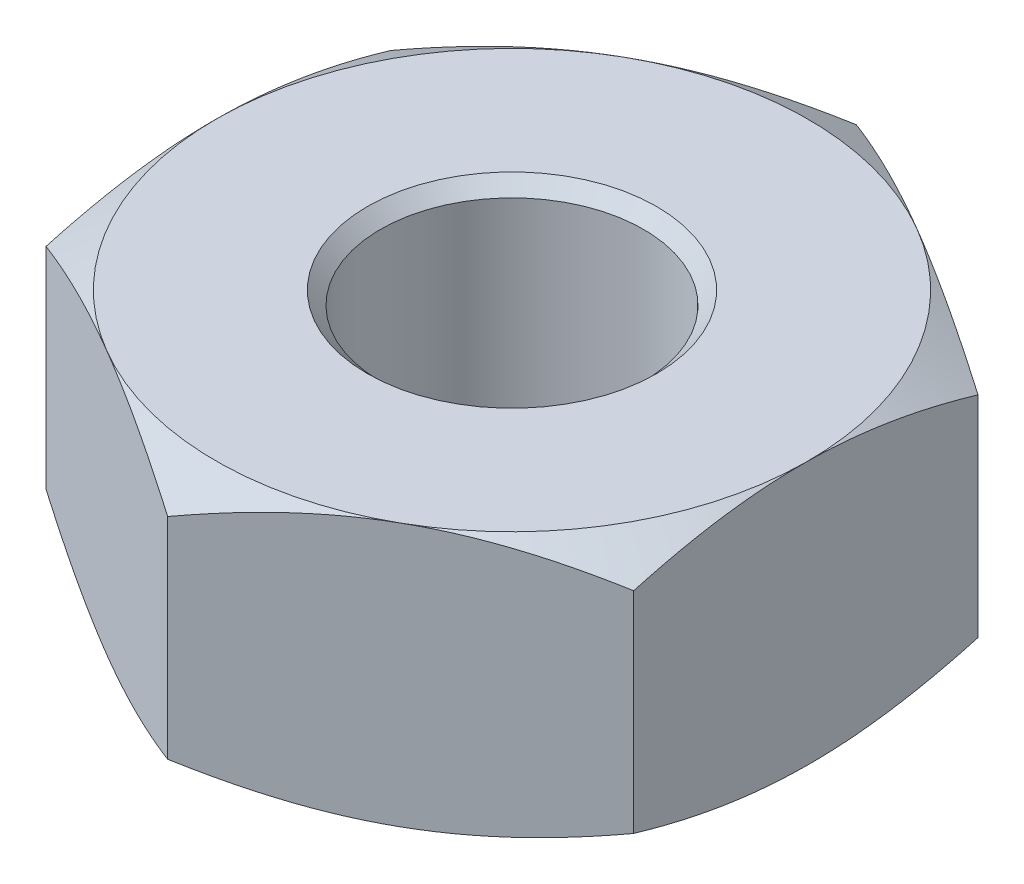
ISO-10303-21;
HEADER;
FILE_DESCRIPTION(('STEP AP214'),'2;1');
FILE_NAME('part.step','',(''),(''),'','','');
FILE_SCHEMA(('AUTOMOTIVE_DESIGN { 1 0 10303 214 1 1 1 1 }'));
ENDSEC;
DATA;
#1=APPLICATION_CONTEXT('core data for automotive mechanical design processes');
#2=APPLICATION_PROTOCOL_DEFINITION('international standard','automotive_design',2000,#1);
#3=PRODUCT_CONTEXT('',#1,'mechanical');
#4=PRODUCT('Part','Part','',(#3));
#5=PRODUCT_RELATED_PRODUCT_CATEGORY('part','',(#4));
#6=PRODUCT_DEFINITION_FORMATION('','',#4);
#7=PRODUCT_DEFINITION_CONTEXT('part definition',#1,'design');
#8=PRODUCT_DEFINITION('design','',#6,#7);
#9=PRODUCT_DEFINITION_SHAPE('','',#8);
#10=(LENGTH_UNIT() NAMED_UNIT(*) SI_UNIT(.MILLI.,.METRE.));
#11=(NAMED_UNIT(*) PLANE_ANGLE_UNIT() SI_UNIT($,.RADIAN.));
#12=(NAMED_UNIT(*) SI_UNIT($,.STERADIAN.) SOLID_ANGLE_UNIT());
#13=UNCERTAINTY_MEASURE_WITH_UNIT(LENGTH_MEASURE(1.E-05),#10,'distance_accuracy_value','');
#14=(GEOMETRIC_REPRESENTATION_CONTEXT(3) GLOBAL_UNCERTAINTY_ASSIGNED_CONTEXT((#13)) GLOBAL_UNIT_ASSIGNED_CONTEXT((#10,
#11,#12)) REPRESENTATION_CONTEXT('',''));
#15=CARTESIAN_POINT('',(0.,0.,0.));
#16=DIRECTION('',(0.,0.,1.));
#17=DIRECTION('',(1.,0.,0.));
#18=AXIS2_PLACEMENT_3D('',#15,#16,#17);
#19=CARTESIAN_POINT('',(0.,2.,0.));
#20=DIRECTION('',(0.,1.,0.));
#21=DIRECTION('',(0.,0.,1.));
#22=AXIS2_PLACEMENT_3D('',#19,#20,#21);
#23=PLANE('',#22);
#24=CARTESIAN_POINT('',(0.,2.,0.));
#25=DIRECTION('',(0.,1.,0.));
#26=DIRECTION('',(0.,0.,1.));
#27=AXIS2_PLACEMENT_3D('',#24,#25,#26);
#28=CIRCLE('',#27,1.1);
#29=CARTESIAN_POINT('',(0.,2.,1.1));
#30=VERTEX_POINT('',#29);
#31=EDGE_CURVE('E12',#30,#30,#28,.F.);
#32=ORIENTED_EDGE('',*,*,#31,.T.);
#33=EDGE_LOOP('',(#32));
#34=FACE_BOUND('',#33,.T.);
#35=CARTESIAN_POINT('',(0.,2.,0.));
#36=DIRECTION('',(0.,1.,0.));
#37=DIRECTION('',(0.,0.,1.));
#38=AXIS2_PLACEMENT_3D('',#35,#36,#37);
#39=CIRCLE('',#38,2.25);
#40=CARTESIAN_POINT('',(-1.13937233150498,2.,1.94018831307709));
#41=VERTEX_POINT('',#40);
#42=CARTESIAN_POINT('',(1.11056620149794,2.,1.95681953999096));
#43=VERTEX_POINT('',#42);
#44=EDGE_CURVE('E146',#41,#43,#39,.T.);
#45=ORIENTED_EDGE('',*,*,#44,.T.);
#46=CARTESIAN_POINT('',(2.24993853300292,2.,0.0166312269138746));
#47=VERTEX_POINT('',#46);
#48=EDGE_CURVE('E589',#43,#47,#39,.T.);
#49=ORIENTED_EDGE('',*,*,#48,.T.);
#50=CARTESIAN_POINT('',(1.13937233150498,2.,-1.94018831307709));
#51=VERTEX_POINT('',#50);
#52=EDGE_CURVE('E64',#47,#51,#39,.T.);
#53=ORIENTED_EDGE('',*,*,#52,.T.);
#54=CARTESIAN_POINT('',(-1.11056620149794,2.,-1.95681953999096));
#55=VERTEX_POINT('',#54);
#56=EDGE_CURVE('E72',#51,#55,#39,.T.);
#57=ORIENTED_EDGE('',*,*,#56,.T.);
#58=CARTESIAN_POINT('',(-2.24993853300292,2.,-0.0166312269138747));
#59=VERTEX_POINT('',#58);
#60=EDGE_CURVE('E596',#55,#59,#39,.T.);
#61=ORIENTED_EDGE('',*,*,#60,.T.);
#62=EDGE_CURVE('E594',#59,#41,#39,.T.);
#63=ORIENTED_EDGE('',*,*,#62,.T.);
#64=EDGE_LOOP('',(#45,#49,#53,#57,#61,#63));
#65=FACE_BOUND('',#64,.T.);
#66=ADVANCED_FACE('F47',(#34,#65),#23,.T.);
#67=CARTESIAN_POINT('',(-0.019204086671358,2.,2.5980052353787));
#68=DIRECTION('',(-0.49358497844353,0.,-0.869697573329316));
#69=DIRECTION('',(-0.869697573329316,0.,0.49358497844353));
#70=AXIS2_PLACEMENT_3D('',#67,#68,#69);
#71=PLANE('',#70);
#72=CARTESIAN_POINT('',(-0.019404086671358,1.79897171609335,2.59811874264687));
#73=CARTESIAN_POINT('',(0.0798924126922162,1.83194468035985,2.54176437073542));
#74=CARTESIAN_POINT('',(0.18004603057104,1.86193269843477,2.48492355291812));
#75=CARTESIAN_POINT('',(0.382087634343671,1.91427779465075,2.37025760040655));
#76=CARTESIAN_POINT('',(0.483979210995293,1.93661635379579,2.31243042782672));
#77=CARTESIAN_POINT('',(0.686499571700327,1.9713905466787,2.19749276335756));
#78=CARTESIAN_POINT('',(0.787097190385136,1.98405760458851,2.14039995894748));
#79=CARTESIAN_POINT('',(0.988765922545457,1.99918112088683,2.02594562462638));
#80=CARTESIAN_POINT('',(1.08983630270829,2.00165010107095,1.96858451089695));
#81=CARTESIAN_POINT('',(1.2787018264508,1.99652159119054,1.86139646263287));
#82=CARTESIAN_POINT('',(1.36652520157543,1.99018332662177,1.8115535056705));
#83=CARTESIAN_POINT('',(1.5415997663507,1.97009231663067,1.71219232779598));
#84=CARTESIAN_POINT('',(1.62885035017403,1.95633270401325,1.66267445071285));
#85=CARTESIAN_POINT('',(1.80428606550557,1.92193378028852,1.56310830677311));
#86=CARTESIAN_POINT('',(1.89244898584057,1.90114861172772,1.51307264556449));
#87=CARTESIAN_POINT('',(2.06745968061786,1.85397408560432,1.41374771623491));
#88=CARTESIAN_POINT('',(2.1543096982811,1.82759581686759,1.36445717500455));
#89=CARTESIAN_POINT('',(2.24053648966724,1.79897171609335,1.31552033733505));
#90=B_SPLINE_CURVE_WITH_KNOTS('',3,(#72,#73,#74,#75,#76,#77,#78,#79,#80,#81,#82,#83,#84,#85,#86,
#87,#88,#89),.UNSPECIFIED.,.F.,.F.,(4,2,2,2,2,2,2,2,4),(0.,0.356658759244272,0.714174967851121,
1.06284222228415,1.41108123519596,1.71433325845153,2.01786637249107,2.32813353663123,
2.63779122560796),.UNSPECIFIED.);
#91=CARTESIAN_POINT('',(-0.0192040866713581,1.79903810567666,2.5980052353787));
#92=VERTEX_POINT('',#91);
#93=EDGE_CURVE('E143',#92,#43,#90,.T.);
#94=ORIENTED_EDGE('',*,*,#93,.F.);
#95=DIRECTION('',(0.,-1.,0.));
#96=VECTOR('',#95,1.);
#97=CARTESIAN_POINT('',(-0.019204086671358,2.,2.5980052353787));
#98=LINE('',#97,#96);
#99=CARTESIAN_POINT('',(-0.019204086671358,0.200961894323341,2.5980052353787));
#100=VERTEX_POINT('',#99);
#101=EDGE_CURVE('E158',#92,#100,#98,.T.);
#102=ORIENTED_EDGE('',*,*,#101,.T.);
#103=CARTESIAN_POINT('',(-0.019404086671358,0.201028283906652,2.59811874264687));
#104=CARTESIAN_POINT('',(0.079892412692216,0.168055319640151,2.54176437073542));
#105=CARTESIAN_POINT('',(0.18004603057104,0.138067301565225,2.48492355291812));
#106=CARTESIAN_POINT('',(0.382087634343672,0.0857222053492496,2.37025760040655));
#107=CARTESIAN_POINT('',(0.483979210995293,0.0633836462042078,2.31243042782672));
#108=CARTESIAN_POINT('',(0.686499571700327,0.0286094533212978,2.19749276335756));
#109=CARTESIAN_POINT('',(0.787097190385136,0.0159423954114897,2.14039995894748));
#110=CARTESIAN_POINT('',(0.988765922545457,0.000818879113173495,2.02594562462638));
#111=CARTESIAN_POINT('',(1.08983630270829,-0.00165010107094531,1.96858451089695));
#112=CARTESIAN_POINT('',(1.2787018264508,0.00347840880945581,1.86139646263287));
#113=CARTESIAN_POINT('',(1.36652520157543,0.00981667337823192,1.8115535056705));
#114=CARTESIAN_POINT('',(1.5415997663507,0.0299076833693292,1.71219232779598));
#115=CARTESIAN_POINT('',(1.62885035017403,0.0436672959867464,1.66267445071285));
#116=CARTESIAN_POINT('',(1.80428606550557,0.0780662197114798,1.56310830677311));
#117=CARTESIAN_POINT('',(1.89244898584057,0.098851388272283,1.51307264556449));
#118=CARTESIAN_POINT('',(2.06745968061786,0.146025914395682,1.41374771623491));
#119=CARTESIAN_POINT('',(2.1543096982811,0.172404183132409,1.36445717500455));
#120=CARTESIAN_POINT('',(2.24053648966724,0.201028283906651,1.31552033733505));
#121=B_SPLINE_CURVE_WITH_KNOTS('',3,(#103,#104,#105,#106,#107,#108,#109,#110,#111,#112,#113,
#114,#115,#116,#117,#118,#119,#120),.UNSPECIFIED.,.F.,.F.,(4,2,2,2,2,2,2,2,4),(0.,
0.356658759244272,0.714174967851121,1.06284222228415,1.41108123519596,1.71433325845153,
2.01786637249107,2.32813353663123,2.63779122560796),.UNSPECIFIED.);
#122=CARTESIAN_POINT('',(1.11056620149794,0.,1.95681953999096));
#123=VERTEX_POINT('',#122);
#124=EDGE_CURVE('E178',#100,#123,#121,.T.);
#125=ORIENTED_EDGE('',*,*,#124,.T.);
#126=CARTESIAN_POINT('',(2.24033648966724,0.200961894323341,1.31563384460322));
#127=VERTEX_POINT('',#126);
#128=EDGE_CURVE('E220',#123,#127,#121,.T.);
#129=ORIENTED_EDGE('',*,*,#128,.T.);
#130=DIRECTION('',(0.,-1.,0.));
#131=VECTOR('',#130,1.);
#132=CARTESIAN_POINT('',(2.24033648966724,2.,1.31563384460322));
#133=LINE('',#132,#131);
#134=CARTESIAN_POINT('',(2.24033648966724,1.79903810567666,1.31563384460322));
#135=VERTEX_POINT('',#134);
#136=EDGE_CURVE('E190',#135,#127,#133,.T.);
#137=ORIENTED_EDGE('',*,*,#136,.F.);
#138=EDGE_CURVE('E161',#43,#135,#90,.T.);
#139=ORIENTED_EDGE('',*,*,#138,.F.);
#140=EDGE_LOOP('',(#94,#102,#125,#129,#137,#139));
#141=FACE_BOUND('',#140,.T.);
#142=ADVANCED_FACE('F156',(#141),#71,.F.);
#143=CARTESIAN_POINT('',(2.24033648966724,2.,1.31563384460322));
#144=DIRECTION('',(-0.999972681334632,0.,-0.00739165640616651));
#145=DIRECTION('',(-0.00739165640616651,0.,0.999972681334632));
#146=AXIS2_PLACEMENT_3D('',#143,#144,#145);
#147=PLANE('',#146);
#148=CARTESIAN_POINT('',(2.24033501129557,1.79898036573907,1.31583384460322));
#149=CARTESIAN_POINT('',(2.24117893955017,1.83195261966336,1.20166387332302));
#150=CARTESIAN_POINT('',(2.24203015252638,1.86193988323136,1.08650839592668));
#151=CARTESIAN_POINT('',(2.24374731869573,1.91428341346944,0.854203325951998));
#152=CARTESIAN_POINT('',(2.24461330240473,1.93662116212813,0.737049605067672));
#153=CARTESIAN_POINT('',(2.24633453737148,1.97139375273715,0.504194091995021));
#154=CARTESIAN_POINT('',(2.24718952376777,1.98406001397112,0.388528131319774));
#155=CARTESIAN_POINT('',(2.24890352038739,1.99918199043516,0.156651850640805));
#156=CARTESIAN_POINT('',(2.24976252437914,2.00165022680918,0.0404423736706198));
#157=CARTESIAN_POINT('',(2.25136767604305,1.99652054119152,-0.176708928433563));
#158=CARTESIAN_POINT('',(2.25211406377353,1.99018213255518,-0.277683229612759));
#159=CARTESIAN_POINT('',(2.25360197643048,1.97009151228299,-0.478973972498862));
#160=CARTESIAN_POINT('',(2.25434349620899,1.95633243500107,-0.579289717771426));
#161=CARTESIAN_POINT('',(2.25583447765745,1.92193518251059,-0.780995618980474));
#162=CARTESIAN_POINT('',(2.25658375058116,1.90115117135797,-0.882360240575894));
#163=CARTESIAN_POINT('',(2.25807111999577,1.85397939984882,-1.08357749147799));
#164=CARTESIAN_POINT('',(2.25880923554803,1.82760272613253,-1.18343269948262));
#165=CARTESIAN_POINT('',(2.25954205471027,1.79898036573907,-1.28257139077547));
#166=B_SPLINE_CURVE_WITH_KNOTS('',3,(#148,#149,#150,#151,#152,#153,#154,#155,#156,#157,#158,
#159,#160,#161,#162,#163,#164,#165),.UNSPECIFIED.,.F.,.F.,(4,2,2,2,2,2,2,2,4),(0.,
0.356656707733596,0.71417080864926,1.06283620758789,1.4110733873951,1.71431215259249,
2.01783195857169,2.32808511030932,2.63772888629171),.UNSPECIFIED.);
#167=EDGE_CURVE('E292',#135,#47,#166,.T.);
#168=ORIENTED_EDGE('',*,*,#167,.F.);
#169=ORIENTED_EDGE('',*,*,#136,.T.);
#170=CARTESIAN_POINT('',(2.24033501129557,0.201019634260934,1.31583384460322));
#171=CARTESIAN_POINT('',(2.24117893955017,0.168047380336639,1.20166387332302));
#172=CARTESIAN_POINT('',(2.24203015252638,0.138060116768636,1.08650839592668));
#173=CARTESIAN_POINT('',(2.24374731869573,0.0857165865305638,0.854203325951998));
#174=CARTESIAN_POINT('',(2.24461330240473,0.0633788378718654,0.737049605067672));
#175=CARTESIAN_POINT('',(2.24633453737148,0.0286062472628484,0.504194091995021));
#176=CARTESIAN_POINT('',(2.24718952376777,0.0159399860288838,0.388528131319775));
#177=CARTESIAN_POINT('',(2.24890352038739,0.000818009564838995,0.156651850640806));
#178=CARTESIAN_POINT('',(2.24976252437914,-0.00165022680917771,0.04044237367062));
#179=CARTESIAN_POINT('',(2.25136767604305,0.00347945880848328,-0.176708928433562));
#180=CARTESIAN_POINT('',(2.25211406377353,0.00981786744482197,-0.277683229612759));
#181=CARTESIAN_POINT('',(2.25360197643048,0.0299084877170064,-0.478973972498862));
#182=CARTESIAN_POINT('',(2.25434349620899,0.0436675649989339,-0.579289717771426));
#183=CARTESIAN_POINT('',(2.25583447765745,0.0780648174894089,-0.780995618980474));
#184=CARTESIAN_POINT('',(2.25658375058116,0.0988488286420346,-0.882360240575894));
#185=CARTESIAN_POINT('',(2.25807111999577,0.146020600151181,-1.08357749147799));
#186=CARTESIAN_POINT('',(2.25880923554803,0.172397273867474,-1.18343269948262));
#187=CARTESIAN_POINT('',(2.25954205471027,0.201019634260934,-1.28257139077547));
#188=B_SPLINE_CURVE_WITH_KNOTS('',3,(#170,#171,#172,#173,#174,#175,#176,#177,#178,#179,#180,
#181,#182,#183,#184,#185,#186,#187),.UNSPECIFIED.,.F.,.F.,(4,2,2,2,2,2,2,2,4),(0.,
0.356656707733596,0.71417080864926,1.06283620758789,1.4110733873951,1.71431215259249,
2.01783195857169,2.32808511030932,2.63772888629171),.UNSPECIFIED.);
#189=CARTESIAN_POINT('',(2.24993853300292,0.,0.0166312269138746));
#190=VERTEX_POINT('',#189);
#191=EDGE_CURVE('E379',#127,#190,#188,.T.);
#192=ORIENTED_EDGE('',*,*,#191,.T.);
#193=CARTESIAN_POINT('',(2.2595405763386,0.200961894323341,-1.28237139077547));
#194=VERTEX_POINT('',#193);
#195=EDGE_CURVE('E254',#190,#194,#188,.T.);
#196=ORIENTED_EDGE('',*,*,#195,.T.);
#197=DIRECTION('',(0.,-1.,0.));
#198=VECTOR('',#197,1.);
#199=CARTESIAN_POINT('',(2.2595405763386,2.,-1.28237139077547));
#200=LINE('',#199,#198);
#201=CARTESIAN_POINT('',(2.2595405763386,1.79903810567666,-1.28237139077547));
#202=VERTEX_POINT('',#201);
#203=EDGE_CURVE('E187',#202,#194,#200,.T.);
#204=ORIENTED_EDGE('',*,*,#203,.F.);
#205=EDGE_CURVE('E286',#47,#202,#166,.T.);
#206=ORIENTED_EDGE('',*,*,#205,.F.);
#207=EDGE_LOOP('',(#168,#169,#192,#196,#204,#206));
#208=FACE_BOUND('',#207,.T.);
#209=ADVANCED_FACE('F264',(#208),#147,.F.);
#210=CARTESIAN_POINT('',(2.2595405763386,2.,-1.28237139077547));
#211=DIRECTION('',(-0.506387702891102,0.,0.862305916923149));
#212=DIRECTION('',(0.862305916923149,0.,0.506387702891102));
#213=AXIS2_PLACEMENT_3D('',#210,#211,#212);
#214=PLANE('',#213);
#215=CARTESIAN_POINT('',(2.2597405763386,1.79897114696605,-1.28225394111104));
#216=CARTESIAN_POINT('',(2.16128798027797,1.83194415797097,-1.34007006295873));
#217=CARTESIAN_POINT('',(2.06198555026358,1.86193222569022,-1.39838524836986));
#218=CARTESIAN_POINT('',(1.86166105996861,1.91427742494297,-1.51602546918067));
#219=CARTESIAN_POINT('',(1.76063543943007,1.93661603741567,-1.57535259533585));
#220=CARTESIAN_POINT('',(1.5598362595915,1.97139033572364,-1.69327157678467));
#221=CARTESIAN_POINT('',(1.46009360090853,1.98405744605249,-1.75184528574279));
#222=CARTESIAN_POINT('',(1.26013880952242,1.99918106366771,-1.86926840148966));
#223=CARTESIAN_POINT('',(1.15992740390653,2.00165009279258,-1.92811738129765));
#224=CARTESIAN_POINT('',(0.97266678196038,1.99652166027434,-2.03808586733985));
#225=CARTESIAN_POINT('',(0.885589574913018,1.99018340518613,-2.08922181107572));
#226=CARTESIAN_POINT('',(0.712002485250336,1.97009236955417,-2.19116053822662));
#227=CARTESIAN_POINT('',(0.625493203321401,1.95633272171342,-2.24196296888958));
#228=CARTESIAN_POINT('',(0.451548027439314,1.9219336880258,-2.34411198157202));
#229=CARTESIAN_POINT('',(0.364134156106762,1.90114844331011,-2.39544563084449));
#230=CARTESIAN_POINT('',(0.190610390501632,1.8539737359391,-2.49734717104884));
#231=CARTESIAN_POINT('',(0.104498272042679,1.82759536225347,-2.54791636813044));
#232=CARTESIAN_POINT('',(0.0190040866713591,1.79897114696605,-2.59812268504313));
#233=B_SPLINE_CURVE_WITH_KNOTS('',3,(#215,#216,#217,#218,#219,#220,#221,#222,#223,#224,#225,
#226,#227,#228,#229,#230,#231,#232),.UNSPECIFIED.,.F.,.F.,(4,2,2,2,2,2,2,2,4),(0.,
0.356658894229,0.714175241517126,1.06284261803755,1.41108175156354,1.71433464716037,
2.01786863683135,2.3281367229481,2.63779532736029),.UNSPECIFIED.);
#234=EDGE_CURVE('E278',#202,#51,#233,.T.);
#235=ORIENTED_EDGE('',*,*,#234,.F.);
#236=ORIENTED_EDGE('',*,*,#203,.T.);
#237=CARTESIAN_POINT('',(2.2597405763386,0.201028853033953,-1.28225394111104));
#238=CARTESIAN_POINT('',(2.16128798027797,0.168055842029029,-1.34007006295873));
#239=CARTESIAN_POINT('',(2.06198555026358,0.138067774309778,-1.39838524836986));
#240=CARTESIAN_POINT('',(1.86166105996861,0.0857225750570337,-1.51602546918067));
#241=CARTESIAN_POINT('',(1.76063543943007,0.0633839625843332,-1.57535259533585));
#242=CARTESIAN_POINT('',(1.5598362595915,0.0286096642763593,-1.69327157678467));
#243=CARTESIAN_POINT('',(1.46009360090853,0.0159425539475146,-1.75184528574279));
#244=CARTESIAN_POINT('',(1.26013880952242,0.000818936332290941,-1.86926840148966));
#245=CARTESIAN_POINT('',(1.15992740390653,-0.00165009279257767,-1.92811738129765));
#246=CARTESIAN_POINT('',(0.97266678196038,0.00347833972565565,-2.03808586733985));
#247=CARTESIAN_POINT('',(0.885589574913019,0.00981659481387424,-2.08922181107572));
#248=CARTESIAN_POINT('',(0.712002485250336,0.0299076304458253,-2.19116053822662));
#249=CARTESIAN_POINT('',(0.625493203321401,0.0436672782865831,-2.24196296888958));
#250=CARTESIAN_POINT('',(0.451548027439314,0.0780663119742041,-2.34411198157202));
#251=CARTESIAN_POINT('',(0.364134156106762,0.0988515566898882,-2.39544563084449));
#252=CARTESIAN_POINT('',(0.190610390501632,0.146026264060897,-2.49734717104884));
#253=CARTESIAN_POINT('',(0.104498272042678,0.172404637746534,-2.54791636813044));
#254=CARTESIAN_POINT('',(0.019004086671359,0.201028853033953,-2.59812268504313));
#255=B_SPLINE_CURVE_WITH_KNOTS('',3,(#237,#238,#239,#240,#241,#242,#243,#244,#245,#246,#247,
#248,#249,#250,#251,#252,#253,#254),.UNSPECIFIED.,.F.,.F.,(4,2,2,2,2,2,2,2,4),(0.,
0.356658894229,0.714175241517126,1.06284261803755,1.41108175156354,1.71433464716037,
2.01786863683135,2.3281367229481,2.63779532736029),.UNSPECIFIED.);
#256=CARTESIAN_POINT('',(1.13937233150498,0.,-1.94018831307709));
#257=VERTEX_POINT('',#256);
#258=EDGE_CURVE('E252',#194,#257,#255,.T.);
#259=ORIENTED_EDGE('',*,*,#258,.T.);
#260=CARTESIAN_POINT('',(0.019204086671359,0.200961894323341,-2.5980052353787));
#261=VERTEX_POINT('',#260);
#262=EDGE_CURVE('E244',#257,#261,#255,.T.);
#263=ORIENTED_EDGE('',*,*,#262,.T.);
#264=DIRECTION('',(0.,-1.,0.));
#265=VECTOR('',#264,1.);
#266=CARTESIAN_POINT('',(0.019204086671359,2.,-2.5980052353787));
#267=LINE('',#266,#265);
#268=CARTESIAN_POINT('',(0.019204086671359,1.79903810567666,-2.5980052353787));
#269=VERTEX_POINT('',#268);
#270=EDGE_CURVE('E184',#269,#261,#267,.T.);
#271=ORIENTED_EDGE('',*,*,#270,.F.);
#272=EDGE_CURVE('E270',#51,#269,#233,.T.);
#273=ORIENTED_EDGE('',*,*,#272,.F.);
#274=EDGE_LOOP('',(#235,#236,#259,#263,#271,#273));
#275=FACE_BOUND('',#274,.T.);
#276=ADVANCED_FACE('F260',(#275),#214,.F.);
#277=CARTESIAN_POINT('',(0.019204086671359,2.,-2.5980052353787));
#278=DIRECTION('',(0.49358497844353,0.,0.869697573329316));
#279=DIRECTION('',(0.869697573329316,0.,-0.49358497844353));
#280=AXIS2_PLACEMENT_3D('',#277,#278,#279);
#281=PLANE('',#280);
#282=CARTESIAN_POINT('',(0.019404086671359,1.79897171609335,-2.59811874264687));
#283=CARTESIAN_POINT('',(-0.0798924126922153,1.83194468035985,-2.54176437073542));
#284=CARTESIAN_POINT('',(-0.180046030571039,1.86193269843477,-2.48492355291812));
#285=CARTESIAN_POINT('',(-0.38208763434367,1.91427779465075,-2.37025760040655));
#286=CARTESIAN_POINT('',(-0.483979210995292,1.93661635379579,-2.31243042782672));
#287=CARTESIAN_POINT('',(-0.686499571700326,1.9713905466787,-2.19749276335756));
#288=CARTESIAN_POINT('',(-0.787097190385135,1.98405760458851,-2.14039995894748));
#289=CARTESIAN_POINT('',(-0.988765922545456,1.99918112088683,-2.02594562462638));
#290=CARTESIAN_POINT('',(-1.08983630270829,2.00165010107095,-1.96858451089695));
#291=CARTESIAN_POINT('',(-1.2787018264508,1.99652159119054,-1.86139646263287));
#292=CARTESIAN_POINT('',(-1.36652520157543,1.99018332662177,-1.8115535056705));
#293=CARTESIAN_POINT('',(-1.5415997663507,1.97009231663067,-1.71219232779598));
#294=CARTESIAN_POINT('',(-1.62885035017403,1.95633270401325,-1.66267445071285));
#295=CARTESIAN_POINT('',(-1.80428606550557,1.92193378028852,-1.56310830677311));
#296=CARTESIAN_POINT('',(-1.89244898584057,1.90114861172772,-1.51307264556449));
#297=CARTESIAN_POINT('',(-2.06745968061786,1.85397408560432,-1.41374771623491));
#298=CARTESIAN_POINT('',(-2.1543096982811,1.82759581686759,-1.36445717500455));
#299=CARTESIAN_POINT('',(-2.24053648966724,1.79897171609335,-1.31552033733505));
#300=B_SPLINE_CURVE_WITH_KNOTS('',3,(#282,#283,#284,#285,#286,#287,#288,#289,#290,#291,#292,
#293,#294,#295,#296,#297,#298,#299),.UNSPECIFIED.,.F.,.F.,(4,2,2,2,2,2,2,2,4),(0.,
0.356658759244272,0.714174967851121,1.06284222228415,1.41108123519596,1.71433325845153,
2.01786637249107,2.32813353663123,2.63779122560796),.UNSPECIFIED.);
#301=EDGE_CURVE('E279',#269,#55,#300,.T.);
#302=ORIENTED_EDGE('',*,*,#301,.F.);
#303=ORIENTED_EDGE('',*,*,#270,.T.);
#304=CARTESIAN_POINT('',(0.019404086671359,0.201028283906652,-2.59811874264687));
#305=CARTESIAN_POINT('',(-0.0798924126922153,0.168055319640151,-2.54176437073542));
#306=CARTESIAN_POINT('',(-0.180046030571039,0.138067301565225,-2.48492355291812));
#307=CARTESIAN_POINT('',(-0.38208763434367,0.0857222053492496,-2.37025760040655));
#308=CARTESIAN_POINT('',(-0.483979210995292,0.0633836462042076,-2.31243042782672));
#309=CARTESIAN_POINT('',(-0.686499571700326,0.0286094533212976,-2.19749276335756));
#310=CARTESIAN_POINT('',(-0.787097190385135,0.0159423954114894,-2.14039995894748));
#311=CARTESIAN_POINT('',(-0.988765922545456,0.00081887911317339,-2.02594562462638));
#312=CARTESIAN_POINT('',(-1.08983630270829,-0.00165010107094525,-1.96858451089695));
#313=CARTESIAN_POINT('',(-1.2787018264508,0.00347840880945576,-1.86139646263287));
#314=CARTESIAN_POINT('',(-1.36652520157543,0.00981667337823165,-1.8115535056705));
#315=CARTESIAN_POINT('',(-1.5415997663507,0.0299076833693289,-1.71219232779598));
#316=CARTESIAN_POINT('',(-1.62885035017403,0.0436672959867464,-1.66267445071285));
#317=CARTESIAN_POINT('',(-1.80428606550557,0.07806621971148,-1.56310830677311));
#318=CARTESIAN_POINT('',(-1.89244898584057,0.0988513882722831,-1.51307264556449));
#319=CARTESIAN_POINT('',(-2.06745968061786,0.146025914395682,-1.41374771623491));
#320=CARTESIAN_POINT('',(-2.1543096982811,0.172404183132409,-1.36445717500455));
#321=CARTESIAN_POINT('',(-2.24053648966724,0.201028283906652,-1.31552033733505));
#322=B_SPLINE_CURVE_WITH_KNOTS('',3,(#304,#305,#306,#307,#308,#309,#310,#311,#312,#313,#314,
#315,#316,#317,#318,#319,#320,#321),.UNSPECIFIED.,.F.,.F.,(4,2,2,2,2,2,2,2,4),(0.,
0.356658759244272,0.714174967851121,1.06284222228415,1.41108123519596,1.71433325845153,
2.01786637249107,2.32813353663123,2.63779122560796),.UNSPECIFIED.);
#323=CARTESIAN_POINT('',(-1.11056620149794,0.,-1.95681953999096));
#324=VERTEX_POINT('',#323);
#325=EDGE_CURVE('E253',#261,#324,#322,.T.);
#326=ORIENTED_EDGE('',*,*,#325,.T.);
#327=CARTESIAN_POINT('',(-2.24033648966724,0.200961894323341,-1.31563384460322));
#328=VERTEX_POINT('',#327);
#329=EDGE_CURVE('E237',#324,#328,#322,.T.);
#330=ORIENTED_EDGE('',*,*,#329,.T.);
#331=DIRECTION('',(0.,-1.,0.));
#332=VECTOR('',#331,1.);
#333=CARTESIAN_POINT('',(-2.24033648966724,2.,-1.31563384460322));
#334=LINE('',#333,#332);
#335=CARTESIAN_POINT('',(-2.24033648966724,1.79903810567666,-1.31563384460322));
#336=VERTEX_POINT('',#335);
#337=EDGE_CURVE('E175',#336,#328,#334,.T.);
#338=ORIENTED_EDGE('',*,*,#337,.F.);
#339=EDGE_CURVE('E280',#55,#336,#300,.T.);
#340=ORIENTED_EDGE('',*,*,#339,.F.);
#341=EDGE_LOOP('',(#302,#303,#326,#330,#338,#340));
#342=FACE_BOUND('',#341,.T.);
#343=ADVANCED_FACE('F263',(#342),#281,.F.);
#344=CARTESIAN_POINT('',(-2.24033648966724,2.,-1.31563384460322));
#345=DIRECTION('',(0.999972681334632,0.,0.00739165640616651));
#346=DIRECTION('',(0.00739165640616651,0.,-0.999972681334632));
#347=AXIS2_PLACEMENT_3D('',#344,#345,#346);
#348=PLANE('',#347);
#349=CARTESIAN_POINT('',(-2.24033501129557,1.79898036573907,-1.31583384460322));
#350=CARTESIAN_POINT('',(-2.24117893955017,1.83195261966336,-1.20166387332302));
#351=CARTESIAN_POINT('',(-2.24203015252638,1.86193988323136,-1.08650839592668));
#352=CARTESIAN_POINT('',(-2.24374731869573,1.91428341346944,-0.854203325951998));
#353=CARTESIAN_POINT('',(-2.24461330240473,1.93662116212813,-0.737049605067672));
#354=CARTESIAN_POINT('',(-2.24633453737149,1.97139375273715,-0.504194091995021));
#355=CARTESIAN_POINT('',(-2.24718952376777,1.98406001397112,-0.388528131319774));
#356=CARTESIAN_POINT('',(-2.24890352038739,1.99918199043516,-0.156651850640805));
#357=CARTESIAN_POINT('',(-2.24976252437914,2.00165022680918,-0.0404423736706198));
#358=CARTESIAN_POINT('',(-2.25136767604305,1.99652054119152,0.176708928433563));
#359=CARTESIAN_POINT('',(-2.25211406377353,1.99018213255518,0.277683229612759));
#360=CARTESIAN_POINT('',(-2.25360197643048,1.97009151228299,0.478973972498862));
#361=CARTESIAN_POINT('',(-2.25434349620899,1.95633243500107,0.579289717771426));
#362=CARTESIAN_POINT('',(-2.25583447765745,1.92193518251059,0.780995618980474));
#363=CARTESIAN_POINT('',(-2.25658375058116,1.90115117135797,0.882360240575893));
#364=CARTESIAN_POINT('',(-2.25807111999577,1.85397939984882,1.08357749147799));
#365=CARTESIAN_POINT('',(-2.25880923554803,1.82760272613253,1.18343269948262));
#366=CARTESIAN_POINT('',(-2.25954205471027,1.79898036573907,1.28257139077547));
#367=B_SPLINE_CURVE_WITH_KNOTS('',3,(#349,#350,#351,#352,#353,#354,#355,#356,#357,#358,#359,
#360,#361,#362,#363,#364,#365,#366),.UNSPECIFIED.,.F.,.F.,(4,2,2,2,2,2,2,2,4),(0.,
0.356656707733596,0.71417080864926,1.06283620758789,1.4110733873951,1.71431215259249,
2.01783195857169,2.32808511030932,2.63772888629171),.UNSPECIFIED.);
#368=EDGE_CURVE('E588',#336,#59,#367,.T.);
#369=ORIENTED_EDGE('',*,*,#368,.F.);
#370=ORIENTED_EDGE('',*,*,#337,.T.);
#371=CARTESIAN_POINT('',(-2.24033501129557,0.201019634260934,-1.31583384460322));
#372=CARTESIAN_POINT('',(-2.24117893955017,0.168047380336639,-1.20166387332302));
#373=CARTESIAN_POINT('',(-2.24203015252638,0.138060116768636,-1.08650839592668));
#374=CARTESIAN_POINT('',(-2.24374731869573,0.0857165865305641,-0.854203325951998));
#375=CARTESIAN_POINT('',(-2.24461330240473,0.0633788378718657,-0.737049605067672));
#376=CARTESIAN_POINT('',(-2.24633453737149,0.0286062472628487,-0.504194091995021));
#377=CARTESIAN_POINT('',(-2.24718952376777,0.0159399860288839,-0.388528131319774));
#378=CARTESIAN_POINT('',(-2.24890352038739,0.000818009564839355,-0.156651850640805));
#379=CARTESIAN_POINT('',(-2.24976252437914,-0.0016502268091771,-0.0404423736706199));
#380=CARTESIAN_POINT('',(-2.25136767604305,0.0034794588084837,0.176708928433563));
#381=CARTESIAN_POINT('',(-2.25211406377353,0.00981786744482204,0.277683229612759));
#382=CARTESIAN_POINT('',(-2.25360197643048,0.0299084877170064,0.478973972498862));
#383=CARTESIAN_POINT('',(-2.25434349620899,0.043667564998934,0.579289717771426));
#384=CARTESIAN_POINT('',(-2.25583447765745,0.0780648174894093,0.780995618980474));
#385=CARTESIAN_POINT('',(-2.25658375058116,0.0988488286420349,0.882360240575893));
#386=CARTESIAN_POINT('',(-2.25807111999577,0.146020600151181,1.08357749147799));
#387=CARTESIAN_POINT('',(-2.25880923554803,0.172397273867474,1.18343269948262));
#388=CARTESIAN_POINT('',(-2.25954205471027,0.201019634260934,1.28257139077547));
#389=B_SPLINE_CURVE_WITH_KNOTS('',3,(#371,#372,#373,#374,#375,#376,#377,#378,#379,#380,#381,
#382,#383,#384,#385,#386,#387,#388),.UNSPECIFIED.,.F.,.F.,(4,2,2,2,2,2,2,2,4),(0.,
0.356656707733596,0.71417080864926,1.06283620758789,1.4110733873951,1.71431215259249,
2.01783195857169,2.32808511030932,2.63772888629171),.UNSPECIFIED.);
#390=CARTESIAN_POINT('',(-2.24993853300292,0.,-0.0166312269138747));
#391=VERTEX_POINT('',#390);
#392=EDGE_CURVE('E341',#328,#391,#389,.T.);
#393=ORIENTED_EDGE('',*,*,#392,.T.);
#394=CARTESIAN_POINT('',(-2.2595405763386,0.200961894323341,1.28237139077547));
#395=VERTEX_POINT('',#394);
#396=EDGE_CURVE('E230',#391,#395,#389,.T.);
#397=ORIENTED_EDGE('',*,*,#396,.T.);
#398=DIRECTION('',(0.,-1.,0.));
#399=VECTOR('',#398,1.);
#400=CARTESIAN_POINT('',(-2.2595405763386,2.,1.28237139077547));
#401=LINE('',#400,#399);
#402=CARTESIAN_POINT('',(-2.2595405763386,1.79903810567666,1.28237139077547));
#403=VERTEX_POINT('',#402);
#404=EDGE_CURVE('E170',#403,#395,#401,.T.);
#405=ORIENTED_EDGE('',*,*,#404,.F.);
#406=EDGE_CURVE('E581',#59,#403,#367,.T.);
#407=ORIENTED_EDGE('',*,*,#406,.F.);
#408=EDGE_LOOP('',(#369,#370,#393,#397,#405,#407));
#409=FACE_BOUND('',#408,.T.);
#410=ADVANCED_FACE('F319',(#409),#348,.F.);
#411=CARTESIAN_POINT('',(-2.2595405763386,2.,1.28237139077547));
#412=DIRECTION('',(0.506387702891102,0.,-0.862305916923149));
#413=DIRECTION('',(-0.862305916923149,0.,-0.506387702891102));
#414=AXIS2_PLACEMENT_3D('',#411,#412,#413);
#415=PLANE('',#414);
#416=CARTESIAN_POINT('',(-2.2597405763386,1.79897114696605,1.28225394111104));
#417=CARTESIAN_POINT('',(-2.16128798027797,1.83194415797097,1.34007006295873));
#418=CARTESIAN_POINT('',(-2.06198555026358,1.86193222569022,1.39838524836986));
#419=CARTESIAN_POINT('',(-1.86166105996861,1.91427742494297,1.51602546918067));
#420=CARTESIAN_POINT('',(-1.76063543943007,1.93661603741567,1.57535259533585));
#421=CARTESIAN_POINT('',(-1.5598362595915,1.97139033572364,1.69327157678467));
#422=CARTESIAN_POINT('',(-1.46009360090853,1.98405744605249,1.75184528574279));
#423=CARTESIAN_POINT('',(-1.26013880952242,1.99918106366771,1.86926840148966));
#424=CARTESIAN_POINT('',(-1.15992740390653,2.00165009279258,1.92811738129765));
#425=CARTESIAN_POINT('',(-0.97266678196038,1.99652166027434,2.03808586733985));
#426=CARTESIAN_POINT('',(-0.885589574913019,1.99018340518613,2.08922181107572));
#427=CARTESIAN_POINT('',(-0.712002485250336,1.97009236955418,2.19116053822662));
#428=CARTESIAN_POINT('',(-0.6254932033214,1.95633272171342,2.24196296888958));
#429=CARTESIAN_POINT('',(-0.451548027439313,1.9219336880258,2.34411198157202));
#430=CARTESIAN_POINT('',(-0.364134156106761,1.90114844331011,2.39544563084449));
#431=CARTESIAN_POINT('',(-0.190610390501631,1.8539737359391,2.49734717104884));
#432=CARTESIAN_POINT('',(-0.104498272042677,1.82759536225347,2.54791636813044));
#433=CARTESIAN_POINT('',(-0.0190040866713579,1.79897114696605,2.59812268504313));
#434=B_SPLINE_CURVE_WITH_KNOTS('',3,(#416,#417,#418,#419,#420,#421,#422,#423,#424,#425,#426,
#427,#428,#429,#430,#431,#432,#433),.UNSPECIFIED.,.F.,.F.,(4,2,2,2,2,2,2,2,4),(0.,
0.356658894229,0.714175241517126,1.06284261803755,1.41108175156354,1.71433464716037,
2.01786863683135,2.3281367229481,2.63779532736029),.UNSPECIFIED.);
#435=EDGE_CURVE('E152',#403,#41,#434,.T.);
#436=ORIENTED_EDGE('',*,*,#435,.F.);
#437=ORIENTED_EDGE('',*,*,#404,.T.);
#438=CARTESIAN_POINT('',(-2.2597405763386,0.201028853033953,1.28225394111104));
#439=CARTESIAN_POINT('',(-2.16128798027797,0.168055842029029,1.34007006295873));
#440=CARTESIAN_POINT('',(-2.06198555026358,0.138067774309778,1.39838524836986));
#441=CARTESIAN_POINT('',(-1.86166105996861,0.0857225750570338,1.51602546918067));
#442=CARTESIAN_POINT('',(-1.76063543943007,0.0633839625843333,1.57535259533585));
#443=CARTESIAN_POINT('',(-1.5598362595915,0.0286096642763592,1.69327157678467));
#444=CARTESIAN_POINT('',(-1.46009360090853,0.0159425539475144,1.75184528574279));
#445=CARTESIAN_POINT('',(-1.26013880952242,0.000818936332290692,1.86926840148966));
#446=CARTESIAN_POINT('',(-1.15992740390653,-0.00165009279257788,1.92811738129765));
#447=CARTESIAN_POINT('',(-0.97266678196038,0.00347833972565537,2.03808586733985));
#448=CARTESIAN_POINT('',(-0.885589574913019,0.00981659481387386,2.08922181107572));
#449=CARTESIAN_POINT('',(-0.712002485250336,0.0299076304458249,2.19116053822662));
#450=CARTESIAN_POINT('',(-0.6254932033214,0.0436672782865828,2.24196296888958));
#451=CARTESIAN_POINT('',(-0.451548027439313,0.078066311974204,2.34411198157202));
#452=CARTESIAN_POINT('',(-0.364134156106761,0.0988515566898881,2.39544563084449));
#453=CARTESIAN_POINT('',(-0.190610390501631,0.146026264060897,2.49734717104884));
#454=CARTESIAN_POINT('',(-0.104498272042677,0.172404637746534,2.54791636813044));
#455=CARTESIAN_POINT('',(-0.0190040866713579,0.201028853033954,2.59812268504313));
#456=B_SPLINE_CURVE_WITH_KNOTS('',3,(#438,#439,#440,#441,#442,#443,#444,#445,#446,#447,#448,
#449,#450,#451,#452,#453,#454,#455),.UNSPECIFIED.,.F.,.F.,(4,2,2,2,2,2,2,2,4),(0.,
0.356658894229,0.714175241517126,1.06284261803755,1.41108175156354,1.71433464716037,
2.01786863683135,2.3281367229481,2.63779532736029),.UNSPECIFIED.);
#457=CARTESIAN_POINT('',(-1.13937233150498,0.,1.94018831307708));
#458=VERTEX_POINT('',#457);
#459=EDGE_CURVE('E153',#395,#458,#456,.T.);
#460=ORIENTED_EDGE('',*,*,#459,.T.);
#461=EDGE_CURVE('E168',#458,#100,#456,.T.);
#462=ORIENTED_EDGE('',*,*,#461,.T.);
#463=ORIENTED_EDGE('',*,*,#101,.F.);
#464=EDGE_CURVE('E140',#41,#92,#434,.T.);
#465=ORIENTED_EDGE('',*,*,#464,.F.);
#466=EDGE_LOOP('',(#436,#437,#460,#462,#463,#465));
#467=FACE_BOUND('',#466,.T.);
#468=ADVANCED_FACE('F166',(#467),#415,.F.);
#469=CARTESIAN_POINT('',(0.,0.,0.));
#470=DIRECTION('',(0.,1.,0.));
#471=DIRECTION('',(0.,0.,1.));
#472=AXIS2_PLACEMENT_3D('',#469,#470,#471);
#473=PLANE('',#472);
#474=CARTESIAN_POINT('',(0.,0.,0.));
#475=DIRECTION('',(0.,1.,0.));
#476=DIRECTION('',(0.,0.,1.));
#477=AXIS2_PLACEMENT_3D('',#474,#475,#476);
#478=CIRCLE('',#477,1.);
#479=CARTESIAN_POINT('',(0.,0.,1.));
#480=VERTEX_POINT('',#479);
#481=EDGE_CURVE('E171',#480,#480,#478,.T.);
#482=ORIENTED_EDGE('',*,*,#481,.T.);
#483=EDGE_LOOP('',(#482));
#484=FACE_BOUND('',#483,.T.);
#485=CARTESIAN_POINT('',(0.,0.,0.));
#486=DIRECTION('',(0.,1.,0.));
#487=DIRECTION('',(0.,0.,1.));
#488=AXIS2_PLACEMENT_3D('',#485,#486,#487);
#489=CIRCLE('',#488,2.25);
#490=EDGE_CURVE('E163',#458,#123,#489,.T.);
#491=ORIENTED_EDGE('',*,*,#490,.F.);
#492=EDGE_CURVE('E327',#391,#458,#489,.T.);
#493=ORIENTED_EDGE('',*,*,#492,.F.);
#494=EDGE_CURVE('E332',#324,#391,#489,.T.);
#495=ORIENTED_EDGE('',*,*,#494,.F.);
#496=EDGE_CURVE('E342',#257,#324,#489,.T.);
#497=ORIENTED_EDGE('',*,*,#496,.F.);
#498=EDGE_CURVE('E334',#190,#257,#489,.T.);
#499=ORIENTED_EDGE('',*,*,#498,.F.);
#500=EDGE_CURVE('E298',#123,#190,#489,.T.);
#501=ORIENTED_EDGE('',*,*,#500,.F.);
#502=EDGE_LOOP('',(#491,#493,#495,#497,#499,#501));
#503=FACE_BOUND('',#502,.T.);
#504=ADVANCED_FACE('F311',(#484,#503),#473,.F.);
#505=CARTESIAN_POINT('',(0.,2.,0.));
#506=DIRECTION('',(0.,-1.,0.));
#507=DIRECTION('',(0.,0.,-1.));
#508=AXIS2_PLACEMENT_3D('',#505,#506,#507);
#509=CYLINDRICAL_SURFACE('',#508,1.);
#510=CARTESIAN_POINT('',(0.,1.9,0.));
#511=DIRECTION('',(0.,1.,0.));
#512=DIRECTION('',(0.,0.,1.));
#513=AXIS2_PLACEMENT_3D('',#510,#511,#512);
#514=CIRCLE('',#513,1.);
#515=CARTESIAN_POINT('',(0.,1.9,1.));
#516=VERTEX_POINT('',#515);
#517=EDGE_CURVE('E57',#516,#516,#514,.T.);
#518=ORIENTED_EDGE('',*,*,#517,.T.);
#519=EDGE_LOOP('',(#518));
#520=FACE_BOUND('',#519,.T.);
#521=ORIENTED_EDGE('',*,*,#481,.F.);
#522=EDGE_LOOP('',(#521));
#523=FACE_BOUND('',#522,.T.);
#524=ADVANCED_FACE('F213',(#520,#523),#509,.F.);
#525=CARTESIAN_POINT('',(0.,0.,0.));
#526=DIRECTION('',(0.,1.,0.));
#527=DIRECTION('',(0.,0.,1.));
#528=AXIS2_PLACEMENT_3D('',#525,#526,#527);
#529=CONICAL_SURFACE('',#528,2.25,1.0471975511966);
#530=ORIENTED_EDGE('',*,*,#461,.F.);
#531=ORIENTED_EDGE('',*,*,#490,.T.);
#532=ORIENTED_EDGE('',*,*,#124,.F.);
#533=EDGE_LOOP('',(#530,#531,#532));
#534=FACE_BOUND('',#533,.T.);
#535=ADVANCED_FACE('F208',(#534),#529,.T.);
#536=ORIENTED_EDGE('',*,*,#492,.T.);
#537=ORIENTED_EDGE('',*,*,#459,.F.);
#538=ORIENTED_EDGE('',*,*,#396,.F.);
#539=EDGE_LOOP('',(#536,#537,#538));
#540=FACE_BOUND('',#539,.T.);
#541=ADVANCED_FACE('F212',(#540),#529,.T.);
#542=ORIENTED_EDGE('',*,*,#494,.T.);
#543=ORIENTED_EDGE('',*,*,#392,.F.);
#544=ORIENTED_EDGE('',*,*,#329,.F.);
#545=EDGE_LOOP('',(#542,#543,#544));
#546=FACE_BOUND('',#545,.T.);
#547=ADVANCED_FACE('F355',(#546),#529,.T.);
#548=ORIENTED_EDGE('',*,*,#496,.T.);
#549=ORIENTED_EDGE('',*,*,#325,.F.);
#550=ORIENTED_EDGE('',*,*,#262,.F.);
#551=EDGE_LOOP('',(#548,#549,#550));
#552=FACE_BOUND('',#551,.T.);
#553=ADVANCED_FACE('F371',(#552),#529,.T.);
#554=ORIENTED_EDGE('',*,*,#498,.T.);
#555=ORIENTED_EDGE('',*,*,#258,.F.);
#556=ORIENTED_EDGE('',*,*,#195,.F.);
#557=EDGE_LOOP('',(#554,#555,#556));
#558=FACE_BOUND('',#557,.T.);
#559=ADVANCED_FACE('F386',(#558),#529,.T.);
#560=ORIENTED_EDGE('',*,*,#500,.T.);
#561=ORIENTED_EDGE('',*,*,#191,.F.);
#562=ORIENTED_EDGE('',*,*,#128,.F.);
#563=EDGE_LOOP('',(#560,#561,#562));
#564=FACE_BOUND('',#563,.T.);
#565=ADVANCED_FACE('F215',(#564),#529,.T.);
#566=CARTESIAN_POINT('',(0.,2.,0.));
#567=DIRECTION('',(0.,-1.,0.));
#568=DIRECTION('',(0.,0.,1.));
#569=AXIS2_PLACEMENT_3D('',#566,#567,#568);
#570=CONICAL_SURFACE('',#569,2.25,1.0471975511966);
#571=ORIENTED_EDGE('',*,*,#93,.T.);
#572=ORIENTED_EDGE('',*,*,#44,.F.);
#573=ORIENTED_EDGE('',*,*,#464,.T.);
#574=EDGE_LOOP('',(#571,#572,#573));
#575=FACE_BOUND('',#574,.T.);
#576=ADVANCED_FACE('F142',(#575),#570,.T.);
#577=ORIENTED_EDGE('',*,*,#406,.T.);
#578=ORIENTED_EDGE('',*,*,#435,.T.);
#579=ORIENTED_EDGE('',*,*,#62,.F.);
#580=EDGE_LOOP('',(#577,#578,#579));
#581=FACE_BOUND('',#580,.T.);
#582=ADVANCED_FACE('F391',(#581),#570,.T.);
#583=ORIENTED_EDGE('',*,*,#339,.T.);
#584=ORIENTED_EDGE('',*,*,#368,.T.);
#585=ORIENTED_EDGE('',*,*,#60,.F.);
#586=EDGE_LOOP('',(#583,#584,#585));
#587=FACE_BOUND('',#586,.T.);
#588=ADVANCED_FACE('F446',(#587),#570,.T.);
#589=ORIENTED_EDGE('',*,*,#272,.T.);
#590=ORIENTED_EDGE('',*,*,#301,.T.);
#591=ORIENTED_EDGE('',*,*,#56,.F.);
#592=EDGE_LOOP('',(#589,#590,#591));
#593=FACE_BOUND('',#592,.T.);
#594=ADVANCED_FACE('F440',(#593),#570,.T.);
#595=ORIENTED_EDGE('',*,*,#205,.T.);
#596=ORIENTED_EDGE('',*,*,#234,.T.);
#597=ORIENTED_EDGE('',*,*,#52,.F.);
#598=EDGE_LOOP('',(#595,#596,#597));
#599=FACE_BOUND('',#598,.T.);
#600=ADVANCED_FACE('F434',(#599),#570,.T.);
#601=ORIENTED_EDGE('',*,*,#138,.T.);
#602=ORIENTED_EDGE('',*,*,#167,.T.);
#603=ORIENTED_EDGE('',*,*,#48,.F.);
#604=EDGE_LOOP('',(#601,#602,#603));
#605=FACE_BOUND('',#604,.T.);
#606=ADVANCED_FACE('F392',(#605),#570,.T.);
#607=CARTESIAN_POINT('',(0.,1.9,0.));
#608=DIRECTION('',(0.,1.,0.));
#609=DIRECTION('',(0.,0.,1.));
#610=AXIS2_PLACEMENT_3D('',#607,#608,#609);
#611=CONICAL_SURFACE('',#610,1.,0.785398163397452);
#612=ORIENTED_EDGE('',*,*,#31,.F.);
#613=EDGE_LOOP('',(#612));
#614=FACE_BOUND('',#613,.T.);
#615=ORIENTED_EDGE('',*,*,#517,.F.);
#616=EDGE_LOOP('',(#615));
#617=FACE_BOUND('',#616,.T.);
#618=ADVANCED_FACE('F50',(#614,#617),#611,.F.);
#619=CLOSED_SHELL('',(#66,#142,#209,#276,#343,#410,#468,#504,#524,#535,#541,#547,#553,#559,#565,
#576,#582,#588,#594,#600,#606,#618));
#620=MANIFOLD_SOLID_BREP('B2',#619);
#621=ADVANCED_BREP_SHAPE_REPRESENTATION('',(#18,#620),#14);
#622=SHAPE_DEFINITION_REPRESENTATION(#9,#621);
ENDSEC;
END-ISO-10303-21;
